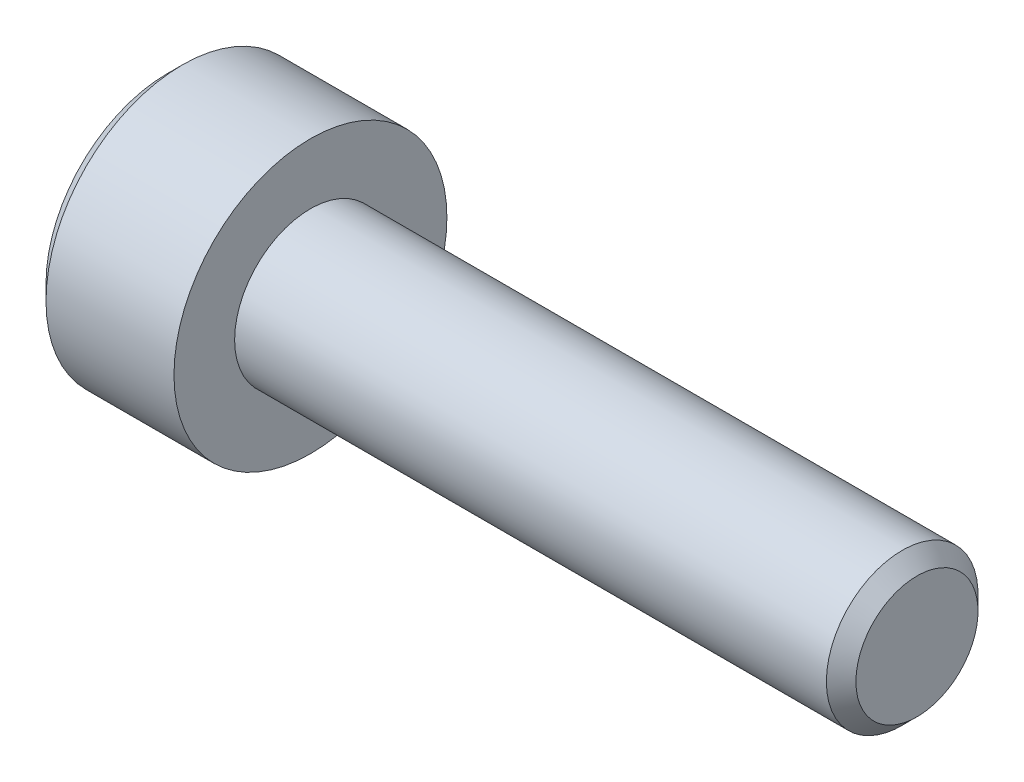
ISO-10303-21;
HEADER;
FILE_DESCRIPTION(('STEP AP214'),'2;1');
FILE_NAME('part.step','',(''),(''),'','','');
FILE_SCHEMA(('AUTOMOTIVE_DESIGN { 1 0 10303 214 1 1 1 1 }'));
ENDSEC;
DATA;
#1=APPLICATION_CONTEXT('core data for automotive mechanical design processes');
#2=APPLICATION_PROTOCOL_DEFINITION('international standard','automotive_design',2000,#1);
#3=PRODUCT_CONTEXT('',#1,'mechanical');
#4=PRODUCT('Part','Part','',(#3));
#5=PRODUCT_RELATED_PRODUCT_CATEGORY('part','',(#4));
#6=PRODUCT_DEFINITION_FORMATION('','',#4);
#7=PRODUCT_DEFINITION_CONTEXT('part definition',#1,'design');
#8=PRODUCT_DEFINITION('design','',#6,#7);
#9=PRODUCT_DEFINITION_SHAPE('','',#8);
#10=(LENGTH_UNIT() NAMED_UNIT(*) SI_UNIT(.MILLI.,.METRE.));
#11=(NAMED_UNIT(*) PLANE_ANGLE_UNIT() SI_UNIT($,.RADIAN.));
#12=(NAMED_UNIT(*) SI_UNIT($,.STERADIAN.) SOLID_ANGLE_UNIT());
#13=UNCERTAINTY_MEASURE_WITH_UNIT(LENGTH_MEASURE(1.E-05),#10,'distance_accuracy_value','');
#14=(GEOMETRIC_REPRESENTATION_CONTEXT(3) GLOBAL_UNCERTAINTY_ASSIGNED_CONTEXT((#13)) GLOBAL_UNIT_ASSIGNED_CONTEXT((#10,
#11,#12)) REPRESENTATION_CONTEXT('',''));
#15=CARTESIAN_POINT('',(0.,0.,0.));
#16=DIRECTION('',(0.,0.,1.));
#17=DIRECTION('',(1.,0.,0.));
#18=AXIS2_PLACEMENT_3D('',#15,#16,#17);
#19=CARTESIAN_POINT('',(-1.26,0.,0.));
#20=DIRECTION('',(1.,0.,0.));
#21=DIRECTION('',(0.,0.,-1.));
#22=AXIS2_PLACEMENT_3D('',#19,#20,#21);
#23=PLANE('',#22);
#24=CARTESIAN_POINT('',(-1.26,0.,0.));
#25=DIRECTION('',(-1.,0.,0.));
#26=DIRECTION('',(0.,0.,1.));
#27=AXIS2_PLACEMENT_3D('',#24,#25,#26);
#28=CIRCLE('',#27,1.);
#29=CARTESIAN_POINT('',(-1.26,0.,1.));
#30=VERTEX_POINT('',#29);
#31=CARTESIAN_POINT('',(-1.26,0.866025403784438,0.5));
#32=VERTEX_POINT('',#31);
#33=EDGE_CURVE('E48',#30,#32,#28,.T.);
#34=ORIENTED_EDGE('',*,*,#33,.F.);
#35=DIRECTION('',(0.,-1.,0.));
#36=VECTOR('',#35,1.);
#37=CARTESIAN_POINT('',(-1.26,0.577350269189626,1.));
#38=LINE('',#37,#36);
#39=CARTESIAN_POINT('',(-1.26,0.577350269189626,1.));
#40=VERTEX_POINT('',#39);
#41=EDGE_CURVE('E160',#40,#30,#38,.T.);
#42=ORIENTED_EDGE('',*,*,#41,.F.);
#43=DIRECTION('',(0.,-0.5,0.866025403784439));
#44=VECTOR('',#43,1.);
#45=CARTESIAN_POINT('',(-1.26,1.15470053837925,0.));
#46=LINE('',#45,#44);
#47=EDGE_CURVE('E196',#32,#40,#46,.T.);
#48=ORIENTED_EDGE('',*,*,#47,.F.);
#49=EDGE_LOOP('',(#34,#42,#48));
#50=FACE_BOUND('',#49,.T.);
#51=ADVANCED_FACE('F37',(#50),#23,.F.);
#52=CARTESIAN_POINT('',(-1.26,0.866025403784438,-0.5));
#53=VERTEX_POINT('',#52);
#54=EDGE_CURVE('E11',#32,#53,#28,.T.);
#55=ORIENTED_EDGE('',*,*,#54,.F.);
#56=CARTESIAN_POINT('',(-1.26,1.15470053837925,0.));
#57=VERTEX_POINT('',#56);
#58=EDGE_CURVE('E285',#57,#32,#46,.T.);
#59=ORIENTED_EDGE('',*,*,#58,.F.);
#60=DIRECTION('',(0.,0.5,0.866025403784439));
#61=VECTOR('',#60,1.);
#62=CARTESIAN_POINT('',(-1.26,0.577350269189626,-1.));
#63=LINE('',#62,#61);
#64=EDGE_CURVE('E175',#53,#57,#63,.T.);
#65=ORIENTED_EDGE('',*,*,#64,.F.);
#66=EDGE_LOOP('',(#55,#59,#65));
#67=FACE_BOUND('',#66,.T.);
#68=ADVANCED_FACE('F125',(#67),#23,.F.);
#69=CARTESIAN_POINT('',(-1.26,0.,-1.));
#70=VERTEX_POINT('',#69);
#71=EDGE_CURVE('E46',#53,#70,#28,.T.);
#72=ORIENTED_EDGE('',*,*,#71,.F.);
#73=CARTESIAN_POINT('',(-1.26,0.577350269189626,-1.));
#74=VERTEX_POINT('',#73);
#75=EDGE_CURVE('E176',#74,#53,#63,.T.);
#76=ORIENTED_EDGE('',*,*,#75,.F.);
#77=DIRECTION('',(0.,1.,0.));
#78=VECTOR('',#77,1.);
#79=CARTESIAN_POINT('',(-1.26,-0.577350269189626,-1.));
#80=LINE('',#79,#78);
#81=EDGE_CURVE('E171',#70,#74,#80,.T.);
#82=ORIENTED_EDGE('',*,*,#81,.F.);
#83=EDGE_LOOP('',(#72,#76,#82));
#84=FACE_BOUND('',#83,.T.);
#85=ADVANCED_FACE('F131',(#84),#23,.F.);
#86=CARTESIAN_POINT('',(-1.26,-0.866025403784438,-0.5));
#87=VERTEX_POINT('',#86);
#88=EDGE_CURVE('E275',#70,#87,#28,.T.);
#89=ORIENTED_EDGE('',*,*,#88,.F.);
#90=CARTESIAN_POINT('',(-1.26,-0.577350269189626,-1.));
#91=VERTEX_POINT('',#90);
#92=EDGE_CURVE('E172',#91,#70,#80,.T.);
#93=ORIENTED_EDGE('',*,*,#92,.F.);
#94=DIRECTION('',(0.,0.5,-0.866025403784439));
#95=VECTOR('',#94,1.);
#96=CARTESIAN_POINT('',(-1.26,-1.15470053837925,0.));
#97=LINE('',#96,#95);
#98=EDGE_CURVE('E166',#87,#91,#97,.T.);
#99=ORIENTED_EDGE('',*,*,#98,.F.);
#100=EDGE_LOOP('',(#89,#93,#99));
#101=FACE_BOUND('',#100,.T.);
#102=ADVANCED_FACE('F143',(#101),#23,.F.);
#103=CARTESIAN_POINT('',(-1.26,-0.866025403784439,0.5));
#104=VERTEX_POINT('',#103);
#105=EDGE_CURVE('E55',#87,#104,#28,.T.);
#106=ORIENTED_EDGE('',*,*,#105,.F.);
#107=CARTESIAN_POINT('',(-1.26,-1.15470053837925,0.));
#108=VERTEX_POINT('',#107);
#109=EDGE_CURVE('E157',#108,#87,#97,.T.);
#110=ORIENTED_EDGE('',*,*,#109,.F.);
#111=DIRECTION('',(0.,-0.5,-0.866025403784439));
#112=VECTOR('',#111,1.);
#113=CARTESIAN_POINT('',(-1.26,-0.577350269189626,1.));
#114=LINE('',#113,#112);
#115=EDGE_CURVE('E154',#104,#108,#114,.T.);
#116=ORIENTED_EDGE('',*,*,#115,.F.);
#117=EDGE_LOOP('',(#106,#110,#116));
#118=FACE_BOUND('',#117,.T.);
#119=ADVANCED_FACE('F135',(#118),#23,.F.);
#120=EDGE_CURVE('E147',#104,#30,#28,.T.);
#121=ORIENTED_EDGE('',*,*,#120,.F.);
#122=CARTESIAN_POINT('',(-1.26,-0.577350269189626,1.));
#123=VERTEX_POINT('',#122);
#124=EDGE_CURVE('E150',#123,#104,#114,.T.);
#125=ORIENTED_EDGE('',*,*,#124,.F.);
#126=EDGE_CURVE('E151',#30,#123,#38,.T.);
#127=ORIENTED_EDGE('',*,*,#126,.F.);
#128=EDGE_LOOP('',(#121,#125,#127));
#129=FACE_BOUND('',#128,.T.);
#130=ADVANCED_FACE('F127',(#129),#23,.F.);
#131=CARTESIAN_POINT('',(-2.36,0.,0.));
#132=DIRECTION('',(1.,0.,0.));
#133=DIRECTION('',(0.,0.,-1.));
#134=AXIS2_PLACEMENT_3D('',#131,#132,#133);
#135=PLANE('',#134);
#136=CARTESIAN_POINT('',(-2.36,0.,0.));
#137=DIRECTION('',(-1.,0.,0.));
#138=DIRECTION('',(0.,0.,1.));
#139=AXIS2_PLACEMENT_3D('',#136,#137,#138);
#140=CIRCLE('',#139,2.);
#141=CARTESIAN_POINT('',(-2.36,0.,2.));
#142=VERTEX_POINT('',#141);
#143=EDGE_CURVE('E41',#142,#142,#140,.T.);
#144=ORIENTED_EDGE('',*,*,#143,.T.);
#145=EDGE_LOOP('',(#144));
#146=FACE_BOUND('',#145,.T.);
#147=DIRECTION('',(0.,-0.5,0.866025403784439));
#148=VECTOR('',#147,1.);
#149=CARTESIAN_POINT('',(-2.36,1.15470053837925,0.));
#150=LINE('',#149,#148);
#151=CARTESIAN_POINT('',(-2.36,1.15470053837925,0.));
#152=VERTEX_POINT('',#151);
#153=CARTESIAN_POINT('',(-2.36,0.577350269189626,1.));
#154=VERTEX_POINT('',#153);
#155=EDGE_CURVE('E63',#152,#154,#150,.T.);
#156=ORIENTED_EDGE('',*,*,#155,.T.);
#157=DIRECTION('',(0.,-1.,0.));
#158=VECTOR('',#157,1.);
#159=CARTESIAN_POINT('',(-2.36,0.577350269189626,1.));
#160=LINE('',#159,#158);
#161=CARTESIAN_POINT('',(-2.36,-0.577350269189626,1.));
#162=VERTEX_POINT('',#161);
#163=EDGE_CURVE('E181',#154,#162,#160,.T.);
#164=ORIENTED_EDGE('',*,*,#163,.T.);
#165=DIRECTION('',(0.,-0.5,-0.866025403784439));
#166=VECTOR('',#165,1.);
#167=CARTESIAN_POINT('',(-2.36,-0.577350269189626,1.));
#168=LINE('',#167,#166);
#169=CARTESIAN_POINT('',(-2.36,-1.15470053837925,0.));
#170=VERTEX_POINT('',#169);
#171=EDGE_CURVE('E184',#162,#170,#168,.T.);
#172=ORIENTED_EDGE('',*,*,#171,.T.);
#173=DIRECTION('',(0.,0.5,-0.866025403784439));
#174=VECTOR('',#173,1.);
#175=CARTESIAN_POINT('',(-2.36,-1.15470053837925,0.));
#176=LINE('',#175,#174);
#177=CARTESIAN_POINT('',(-2.36,-0.577350269189626,-1.));
#178=VERTEX_POINT('',#177);
#179=EDGE_CURVE('E187',#170,#178,#176,.T.);
#180=ORIENTED_EDGE('',*,*,#179,.T.);
#181=DIRECTION('',(0.,1.,0.));
#182=VECTOR('',#181,1.);
#183=CARTESIAN_POINT('',(-2.36,-0.577350269189626,-1.));
#184=LINE('',#183,#182);
#185=CARTESIAN_POINT('',(-2.36,0.577350269189626,-1.));
#186=VERTEX_POINT('',#185);
#187=EDGE_CURVE('E190',#178,#186,#184,.T.);
#188=ORIENTED_EDGE('',*,*,#187,.T.);
#189=DIRECTION('',(0.,0.5,0.866025403784439));
#190=VECTOR('',#189,1.);
#191=CARTESIAN_POINT('',(-2.36,0.577350269189626,-1.));
#192=LINE('',#191,#190);
#193=EDGE_CURVE('E193',#186,#152,#192,.T.);
#194=ORIENTED_EDGE('',*,*,#193,.T.);
#195=EDGE_LOOP('',(#156,#164,#172,#180,#188,#194));
#196=FACE_BOUND('',#195,.T.);
#197=ADVANCED_FACE('F39',(#146,#196),#135,.F.);
#198=CARTESIAN_POINT('',(-2.11,0.,0.));
#199=DIRECTION('',(1.,0.,0.));
#200=DIRECTION('',(0.,0.,-1.));
#201=AXIS2_PLACEMENT_3D('',#198,#199,#200);
#202=CONICAL_SURFACE('',#201,2.25,0.785398163397448);
#203=ORIENTED_EDGE('',*,*,#143,.F.);
#204=EDGE_LOOP('',(#203));
#205=FACE_BOUND('',#204,.T.);
#206=CARTESIAN_POINT('',(-2.11,0.,0.));
#207=DIRECTION('',(-1.,0.,0.));
#208=DIRECTION('',(0.,0.,1.));
#209=AXIS2_PLACEMENT_3D('',#206,#207,#208);
#210=CIRCLE('',#209,2.25);
#211=CARTESIAN_POINT('',(-2.11,0.,2.25));
#212=VERTEX_POINT('',#211);
#213=EDGE_CURVE('E218',#212,#212,#210,.T.);
#214=ORIENTED_EDGE('',*,*,#213,.T.);
#215=EDGE_LOOP('',(#214));
#216=FACE_BOUND('',#215,.T.);
#217=ADVANCED_FACE('F141',(#205,#216),#202,.T.);
#218=CARTESIAN_POINT('',(10.,0.,0.));
#219=DIRECTION('',(-1.,0.,0.));
#220=DIRECTION('',(0.,0.,1.));
#221=AXIS2_PLACEMENT_3D('',#218,#219,#220);
#222=CYLINDRICAL_SURFACE('',#221,2.25);
#223=ORIENTED_EDGE('',*,*,#213,.F.);
#224=EDGE_LOOP('',(#223));
#225=FACE_BOUND('',#224,.T.);
#226=CARTESIAN_POINT('',(0.,0.,0.));
#227=DIRECTION('',(-1.,0.,0.));
#228=DIRECTION('',(0.,0.,1.));
#229=AXIS2_PLACEMENT_3D('',#226,#227,#228);
#230=CIRCLE('',#229,2.25);
#231=CARTESIAN_POINT('',(0.,0.,2.25));
#232=VERTEX_POINT('',#231);
#233=EDGE_CURVE('E216',#232,#232,#230,.T.);
#234=ORIENTED_EDGE('',*,*,#233,.T.);
#235=EDGE_LOOP('',(#234));
#236=FACE_BOUND('',#235,.T.);
#237=ADVANCED_FACE('F227',(#225,#236),#222,.T.);
#238=CARTESIAN_POINT('',(0.,2.25,0.));
#239=DIRECTION('',(-1.,0.,0.));
#240=DIRECTION('',(0.,0.,1.));
#241=AXIS2_PLACEMENT_3D('',#238,#239,#240);
#242=PLANE('',#241);
#243=ORIENTED_EDGE('',*,*,#233,.F.);
#244=EDGE_LOOP('',(#243));
#245=FACE_BOUND('',#244,.T.);
#246=CARTESIAN_POINT('',(0.,0.,0.));
#247=DIRECTION('',(-1.,0.,0.));
#248=DIRECTION('',(0.,0.,1.));
#249=AXIS2_PLACEMENT_3D('',#246,#247,#248);
#250=CIRCLE('',#249,1.25);
#251=CARTESIAN_POINT('',(0.,0.,1.25));
#252=VERTEX_POINT('',#251);
#253=EDGE_CURVE('E213',#252,#252,#250,.T.);
#254=ORIENTED_EDGE('',*,*,#253,.T.);
#255=EDGE_LOOP('',(#254));
#256=FACE_BOUND('',#255,.T.);
#257=ADVANCED_FACE('F231',(#245,#256),#242,.F.);
#258=CARTESIAN_POINT('',(10.,0.,0.));
#259=DIRECTION('',(-1.,0.,0.));
#260=DIRECTION('',(0.,0.,1.));
#261=AXIS2_PLACEMENT_3D('',#258,#259,#260);
#262=CYLINDRICAL_SURFACE('',#261,1.25);
#263=ORIENTED_EDGE('',*,*,#253,.F.);
#264=EDGE_LOOP('',(#263));
#265=FACE_BOUND('',#264,.T.);
#266=CARTESIAN_POINT('',(9.7565,0.,0.));
#267=DIRECTION('',(-1.,0.,0.));
#268=DIRECTION('',(0.,0.,1.));
#269=AXIS2_PLACEMENT_3D('',#266,#267,#268);
#270=CIRCLE('',#269,1.25);
#271=CARTESIAN_POINT('',(9.7565,0.,1.25));
#272=VERTEX_POINT('',#271);
#273=EDGE_CURVE('E210',#272,#272,#270,.T.);
#274=ORIENTED_EDGE('',*,*,#273,.T.);
#275=EDGE_LOOP('',(#274));
#276=FACE_BOUND('',#275,.T.);
#277=ADVANCED_FACE('F237',(#265,#276),#262,.T.);
#278=CARTESIAN_POINT('',(10.,0.,0.));
#279=DIRECTION('',(-1.,0.,0.));
#280=DIRECTION('',(0.,0.,1.));
#281=AXIS2_PLACEMENT_3D('',#278,#279,#280);
#282=CONICAL_SURFACE('',#281,1.0065,0.785398163397447);
#283=ORIENTED_EDGE('',*,*,#273,.F.);
#284=EDGE_LOOP('',(#283));
#285=FACE_BOUND('',#284,.T.);
#286=CARTESIAN_POINT('',(10.,0.,0.));
#287=DIRECTION('',(-1.,0.,0.));
#288=DIRECTION('',(0.,0.,1.));
#289=AXIS2_PLACEMENT_3D('',#286,#287,#288);
#290=CIRCLE('',#289,1.0065);
#291=CARTESIAN_POINT('',(10.,0.,1.0065));
#292=VERTEX_POINT('',#291);
#293=EDGE_CURVE('E207',#292,#292,#290,.T.);
#294=ORIENTED_EDGE('',*,*,#293,.T.);
#295=EDGE_LOOP('',(#294));
#296=FACE_BOUND('',#295,.T.);
#297=ADVANCED_FACE('F241',(#285,#296),#282,.T.);
#298=CARTESIAN_POINT('',(10.,1.0065,0.));
#299=DIRECTION('',(-1.,0.,0.));
#300=DIRECTION('',(0.,0.,1.));
#301=AXIS2_PLACEMENT_3D('',#298,#299,#300);
#302=PLANE('',#301);
#303=ORIENTED_EDGE('',*,*,#293,.F.);
#304=EDGE_LOOP('',(#303));
#305=FACE_BOUND('',#304,.T.);
#306=ADVANCED_FACE('F245',(#305),#302,.F.);
#307=CARTESIAN_POINT('',(-1.26,1.15470053837925,0.));
#308=DIRECTION('',(0.,-0.866025403784439,-0.5));
#309=DIRECTION('',(0.,0.5,-0.866025403784439));
#310=AXIS2_PLACEMENT_3D('',#307,#308,#309);
#311=PLANE('',#310);
#312=ORIENTED_EDGE('',*,*,#155,.F.);
#313=DIRECTION('',(-1.,0.,0.));
#314=VECTOR('',#313,1.);
#315=CARTESIAN_POINT('',(-1.26,1.15470053837925,0.));
#316=LINE('',#315,#314);
#317=EDGE_CURVE('E179',#57,#152,#316,.T.);
#318=ORIENTED_EDGE('',*,*,#317,.F.);
#319=ORIENTED_EDGE('',*,*,#58,.T.);
#320=ORIENTED_EDGE('',*,*,#47,.T.);
#321=DIRECTION('',(-1.,0.,0.));
#322=VECTOR('',#321,1.);
#323=CARTESIAN_POINT('',(-1.26,0.577350269189626,1.));
#324=LINE('',#323,#322);
#325=EDGE_CURVE('E205',#40,#154,#324,.T.);
#326=ORIENTED_EDGE('',*,*,#325,.T.);
#327=EDGE_LOOP('',(#312,#318,#319,#320,#326));
#328=FACE_BOUND('',#327,.T.);
#329=ADVANCED_FACE('F249',(#328),#311,.T.);
#330=CARTESIAN_POINT('',(-1.26,0.577350269189626,1.));
#331=DIRECTION('',(0.,0.,-1.));
#332=DIRECTION('',(-1.,0.,0.));
#333=AXIS2_PLACEMENT_3D('',#330,#331,#332);
#334=PLANE('',#333);
#335=ORIENTED_EDGE('',*,*,#163,.F.);
#336=ORIENTED_EDGE('',*,*,#325,.F.);
#337=ORIENTED_EDGE('',*,*,#41,.T.);
#338=ORIENTED_EDGE('',*,*,#126,.T.);
#339=DIRECTION('',(-1.,0.,0.));
#340=VECTOR('',#339,1.);
#341=CARTESIAN_POINT('',(-1.26,-0.577350269189626,1.));
#342=LINE('',#341,#340);
#343=EDGE_CURVE('E165',#123,#162,#342,.T.);
#344=ORIENTED_EDGE('',*,*,#343,.T.);
#345=EDGE_LOOP('',(#335,#336,#337,#338,#344));
#346=FACE_BOUND('',#345,.T.);
#347=ADVANCED_FACE('F253',(#346),#334,.T.);
#348=CARTESIAN_POINT('',(-1.26,-0.577350269189626,1.));
#349=DIRECTION('',(0.,0.866025403784439,-0.5));
#350=DIRECTION('',(0.,0.5,0.866025403784439));
#351=AXIS2_PLACEMENT_3D('',#348,#349,#350);
#352=PLANE('',#351);
#353=ORIENTED_EDGE('',*,*,#171,.F.);
#354=ORIENTED_EDGE('',*,*,#343,.F.);
#355=ORIENTED_EDGE('',*,*,#124,.T.);
#356=ORIENTED_EDGE('',*,*,#115,.T.);
#357=DIRECTION('',(-1.,0.,0.));
#358=VECTOR('',#357,1.);
#359=CARTESIAN_POINT('',(-1.26,-1.15470053837925,0.));
#360=LINE('',#359,#358);
#361=EDGE_CURVE('E202',#108,#170,#360,.T.);
#362=ORIENTED_EDGE('',*,*,#361,.T.);
#363=EDGE_LOOP('',(#353,#354,#355,#356,#362));
#364=FACE_BOUND('',#363,.T.);
#365=ADVANCED_FACE('F164',(#364),#352,.T.);
#366=CARTESIAN_POINT('',(-1.26,-1.15470053837925,0.));
#367=DIRECTION('',(0.,0.866025403784439,0.5));
#368=DIRECTION('',(0.,-0.5,0.866025403784439));
#369=AXIS2_PLACEMENT_3D('',#366,#367,#368);
#370=PLANE('',#369);
#371=ORIENTED_EDGE('',*,*,#179,.F.);
#372=ORIENTED_EDGE('',*,*,#361,.F.);
#373=ORIENTED_EDGE('',*,*,#109,.T.);
#374=ORIENTED_EDGE('',*,*,#98,.T.);
#375=DIRECTION('',(-1.,0.,0.));
#376=VECTOR('',#375,1.);
#377=CARTESIAN_POINT('',(-1.26,-0.577350269189626,-1.));
#378=LINE('',#377,#376);
#379=EDGE_CURVE('E200',#91,#178,#378,.T.);
#380=ORIENTED_EDGE('',*,*,#379,.T.);
#381=EDGE_LOOP('',(#371,#372,#373,#374,#380));
#382=FACE_BOUND('',#381,.T.);
#383=ADVANCED_FACE('F259',(#382),#370,.T.);
#384=CARTESIAN_POINT('',(-1.26,-0.577350269189626,-1.));
#385=DIRECTION('',(0.,0.,1.));
#386=DIRECTION('',(1.,0.,0.));
#387=AXIS2_PLACEMENT_3D('',#384,#385,#386);
#388=PLANE('',#387);
#389=ORIENTED_EDGE('',*,*,#187,.F.);
#390=ORIENTED_EDGE('',*,*,#379,.F.);
#391=ORIENTED_EDGE('',*,*,#92,.T.);
#392=ORIENTED_EDGE('',*,*,#81,.T.);
#393=DIRECTION('',(-1.,0.,0.));
#394=VECTOR('',#393,1.);
#395=CARTESIAN_POINT('',(-1.26,0.577350269189626,-1.));
#396=LINE('',#395,#394);
#397=EDGE_CURVE('E198',#74,#186,#396,.T.);
#398=ORIENTED_EDGE('',*,*,#397,.T.);
#399=EDGE_LOOP('',(#389,#390,#391,#392,#398));
#400=FACE_BOUND('',#399,.T.);
#401=ADVANCED_FACE('F120',(#400),#388,.T.);
#402=CARTESIAN_POINT('',(-1.26,0.577350269189626,-1.));
#403=DIRECTION('',(0.,-0.866025403784439,0.5));
#404=DIRECTION('',(0.,-0.5,-0.866025403784439));
#405=AXIS2_PLACEMENT_3D('',#402,#403,#404);
#406=PLANE('',#405);
#407=ORIENTED_EDGE('',*,*,#193,.F.);
#408=ORIENTED_EDGE('',*,*,#397,.F.);
#409=ORIENTED_EDGE('',*,*,#75,.T.);
#410=ORIENTED_EDGE('',*,*,#64,.T.);
#411=ORIENTED_EDGE('',*,*,#317,.T.);
#412=EDGE_LOOP('',(#407,#408,#409,#410,#411));
#413=FACE_BOUND('',#412,.T.);
#414=ADVANCED_FACE('F115',(#413),#406,.T.);
#415=CARTESIAN_POINT('',(-0.682649730810374,0.,0.));
#416=DIRECTION('',(-1.,0.,0.));
#417=DIRECTION('',(0.,0.,1.));
#418=AXIS2_PLACEMENT_3D('',#415,#416,#417);
#419=CONICAL_SURFACE('',#418,0.,1.0471975511966);
#420=ORIENTED_EDGE('',*,*,#33,.T.);
#421=ORIENTED_EDGE('',*,*,#54,.T.);
#422=ORIENTED_EDGE('',*,*,#71,.T.);
#423=ORIENTED_EDGE('',*,*,#88,.T.);
#424=ORIENTED_EDGE('',*,*,#105,.T.);
#425=ORIENTED_EDGE('',*,*,#120,.T.);
#426=EDGE_LOOP('',(#420,#421,#422,#423,#424,#425));
#427=FACE_BOUND('',#426,.T.);
#428=CARTESIAN_POINT('',(-0.682649730810374,0.,0.));
#429=VERTEX_POINT('',#428);
#430=VERTEX_LOOP('',#429);
#431=FACE_BOUND('',#430,.T.);
#432=ADVANCED_FACE('F113',(#427,#431),#419,.F.);
#433=CLOSED_SHELL('',(#51,#68,#85,#102,#119,#130,#197,#217,#237,#257,#277,#297,#306,#329,#347,
#365,#383,#401,#414,#432));
#434=MANIFOLD_SOLID_BREP('B2',#433);
#435=ADVANCED_BREP_SHAPE_REPRESENTATION('',(#18,#434),#14);
#436=SHAPE_DEFINITION_REPRESENTATION(#9,#435);
ENDSEC;
END-ISO-10303-21;
